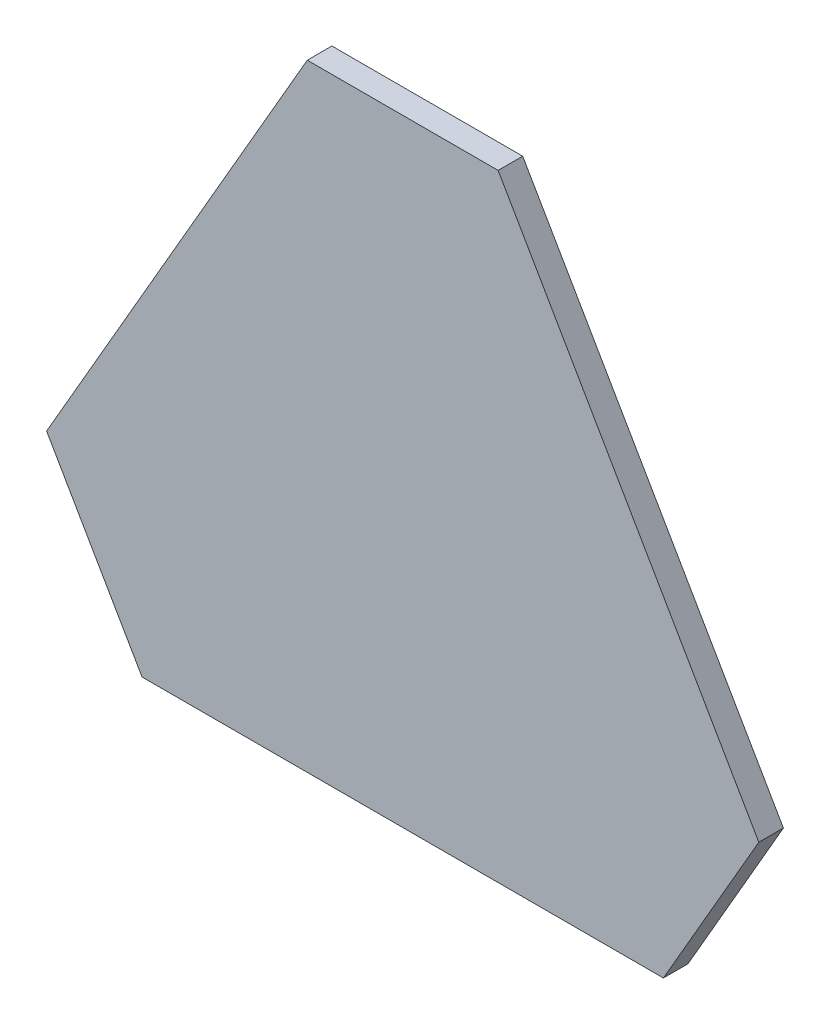
ISO-10303-21;
HEADER;
FILE_DESCRIPTION(('STEP AP214'),'2;1');
FILE_NAME('part.step','',(''),(''),'','','');
FILE_SCHEMA(('AUTOMOTIVE_DESIGN { 1 0 10303 214 1 1 1 1 }'));
ENDSEC;
DATA;
#1=APPLICATION_CONTEXT('core data for automotive mechanical design processes');
#2=APPLICATION_PROTOCOL_DEFINITION('international standard','automotive_design',2000,#1);
#3=PRODUCT_CONTEXT('',#1,'mechanical');
#4=PRODUCT('Part','Part','',(#3));
#5=PRODUCT_RELATED_PRODUCT_CATEGORY('part','',(#4));
#6=PRODUCT_DEFINITION_FORMATION('','',#4);
#7=PRODUCT_DEFINITION_CONTEXT('part definition',#1,'design');
#8=PRODUCT_DEFINITION('design','',#6,#7);
#9=PRODUCT_DEFINITION_SHAPE('','',#8);
#10=(LENGTH_UNIT() NAMED_UNIT(*) SI_UNIT(.MILLI.,.METRE.));
#11=(NAMED_UNIT(*) PLANE_ANGLE_UNIT() SI_UNIT($,.RADIAN.));
#12=(NAMED_UNIT(*) SI_UNIT($,.STERADIAN.) SOLID_ANGLE_UNIT());
#13=UNCERTAINTY_MEASURE_WITH_UNIT(LENGTH_MEASURE(1.E-05),#10,'distance_accuracy_value','');
#14=(GEOMETRIC_REPRESENTATION_CONTEXT(3) GLOBAL_UNCERTAINTY_ASSIGNED_CONTEXT((#13)) GLOBAL_UNIT_ASSIGNED_CONTEXT((#10,
#11,#12)) REPRESENTATION_CONTEXT('',''));
#15=CARTESIAN_POINT('',(0.,0.,0.));
#16=DIRECTION('',(0.,0.,1.));
#17=DIRECTION('',(1.,0.,0.));
#18=AXIS2_PLACEMENT_3D('',#15,#16,#17);
#19=CARTESIAN_POINT('',(1060.66017177982,-1060.66017177982,-100.));
#20=DIRECTION('',(-0.866025403784437,0.500000000000003,0.));
#21=DIRECTION('',(-0.500000000000003,-0.866025403784437,0.));
#22=AXIS2_PLACEMENT_3D('',#19,#20,#21);
#23=PLANE('',#22);
#24=DIRECTION('',(-0.500000000000003,-0.866025403784437,0.));
#25=VECTOR('',#24,1.);
#26=CARTESIAN_POINT('',(1060.66017177982,-1060.66017177982,0.));
#27=LINE('',#26,#25);
#28=CARTESIAN_POINT('',(1448.8887394336,-388.228567653789,0.));
#29=VERTEX_POINT('',#28);
#30=CARTESIAN_POINT('',(1060.66017177982,-1060.66017177982,0.));
#31=VERTEX_POINT('',#30);
#32=EDGE_CURVE('E128',#29,#31,#27,.T.);
#33=ORIENTED_EDGE('',*,*,#32,.T.);
#34=DIRECTION('',(0.,0.,1.));
#35=VECTOR('',#34,1.);
#36=CARTESIAN_POINT('',(1060.66017177982,-1060.66017177982,-100.));
#37=LINE('',#36,#35);
#38=CARTESIAN_POINT('',(1060.66017177982,-1060.66017177982,-100.));
#39=VERTEX_POINT('',#38);
#40=EDGE_CURVE('E11',#39,#31,#37,.T.);
#41=ORIENTED_EDGE('',*,*,#40,.F.);
#42=DIRECTION('',(-0.500000000000003,-0.866025403784437,0.));
#43=VECTOR('',#42,1.);
#44=CARTESIAN_POINT('',(1060.66017177982,-1060.66017177982,-100.));
#45=LINE('',#44,#43);
#46=CARTESIAN_POINT('',(1448.8887394336,-388.228567653789,-100.));
#47=VERTEX_POINT('',#46);
#48=EDGE_CURVE('E144',#47,#39,#45,.T.);
#49=ORIENTED_EDGE('',*,*,#48,.F.);
#50=DIRECTION('',(0.,0.,1.));
#51=VECTOR('',#50,1.);
#52=CARTESIAN_POINT('',(1448.8887394336,-388.228567653789,-100.));
#53=LINE('',#52,#51);
#54=EDGE_CURVE('E124',#47,#29,#53,.T.);
#55=ORIENTED_EDGE('',*,*,#54,.T.);
#56=EDGE_LOOP('',(#33,#41,#49,#55));
#57=FACE_BOUND('',#56,.T.);
#58=ADVANCED_FACE('F39',(#57),#23,.F.);
#59=CARTESIAN_POINT('',(-1060.66017177982,-1060.66017177982,-100.));
#60=DIRECTION('',(0.,1.,0.));
#61=DIRECTION('',(-1.,0.,0.));
#62=AXIS2_PLACEMENT_3D('',#59,#60,#61);
#63=PLANE('',#62);
#64=DIRECTION('',(-1.,0.,0.));
#65=VECTOR('',#64,1.);
#66=CARTESIAN_POINT('',(-1060.66017177982,-1060.66017177982,0.));
#67=LINE('',#66,#65);
#68=CARTESIAN_POINT('',(-1060.66017177982,-1060.66017177982,0.));
#69=VERTEX_POINT('',#68);
#70=EDGE_CURVE('E132',#31,#69,#67,.T.);
#71=ORIENTED_EDGE('',*,*,#70,.T.);
#72=DIRECTION('',(0.,0.,1.));
#73=VECTOR('',#72,1.);
#74=CARTESIAN_POINT('',(-1060.66017177982,-1060.66017177982,-100.));
#75=LINE('',#74,#73);
#76=CARTESIAN_POINT('',(-1060.66017177982,-1060.66017177982,-100.));
#77=VERTEX_POINT('',#76);
#78=EDGE_CURVE('E48',#77,#69,#75,.T.);
#79=ORIENTED_EDGE('',*,*,#78,.F.);
#80=DIRECTION('',(-1.,0.,0.));
#81=VECTOR('',#80,1.);
#82=CARTESIAN_POINT('',(-1060.66017177982,-1060.66017177982,-100.));
#83=LINE('',#82,#81);
#84=EDGE_CURVE('E93',#39,#77,#83,.T.);
#85=ORIENTED_EDGE('',*,*,#84,.F.);
#86=ORIENTED_EDGE('',*,*,#40,.T.);
#87=EDGE_LOOP('',(#71,#79,#85,#86));
#88=FACE_BOUND('',#87,.T.);
#89=ADVANCED_FACE('F172',(#88),#63,.F.);
#90=CARTESIAN_POINT('',(-1448.8887394336,-388.228567653779,-100.));
#91=DIRECTION('',(0.866025403784438,0.500000000000001,0.));
#92=DIRECTION('',(-0.500000000000001,0.866025403784438,0.));
#93=AXIS2_PLACEMENT_3D('',#90,#91,#92);
#94=PLANE('',#93);
#95=DIRECTION('',(-0.500000000000001,0.866025403784438,0.));
#96=VECTOR('',#95,1.);
#97=CARTESIAN_POINT('',(-1448.8887394336,-388.228567653779,0.));
#98=LINE('',#97,#96);
#99=CARTESIAN_POINT('',(-1448.8887394336,-388.228567653779,0.));
#100=VERTEX_POINT('',#99);
#101=EDGE_CURVE('E135',#69,#100,#98,.T.);
#102=ORIENTED_EDGE('',*,*,#101,.T.);
#103=DIRECTION('',(0.,0.,1.));
#104=VECTOR('',#103,1.);
#105=CARTESIAN_POINT('',(-1448.8887394336,-388.228567653779,-100.));
#106=LINE('',#105,#104);
#107=CARTESIAN_POINT('',(-1448.8887394336,-388.228567653779,-100.));
#108=VERTEX_POINT('',#107);
#109=EDGE_CURVE('E117',#108,#100,#106,.T.);
#110=ORIENTED_EDGE('',*,*,#109,.F.);
#111=DIRECTION('',(-0.500000000000001,0.866025403784438,0.));
#112=VECTOR('',#111,1.);
#113=CARTESIAN_POINT('',(-1448.8887394336,-388.228567653779,-100.));
#114=LINE('',#113,#112);
#115=EDGE_CURVE('E106',#77,#108,#114,.T.);
#116=ORIENTED_EDGE('',*,*,#115,.F.);
#117=ORIENTED_EDGE('',*,*,#78,.T.);
#118=EDGE_LOOP('',(#102,#110,#116,#117));
#119=FACE_BOUND('',#118,.T.);
#120=ADVANCED_FACE('F154',(#119),#94,.F.);
#121=CARTESIAN_POINT('',(-388.228567653759,1448.88873943361,-100.));
#122=DIRECTION('',(0.866025403784434,-0.500000000000007,0.));
#123=DIRECTION('',(0.500000000000007,0.866025403784435,0.));
#124=AXIS2_PLACEMENT_3D('',#121,#122,#123);
#125=PLANE('',#124);
#126=DIRECTION('',(0.500000000000007,0.866025403784434,0.));
#127=VECTOR('',#126,1.);
#128=CARTESIAN_POINT('',(-388.228567653759,1448.88873943361,0.));
#129=LINE('',#128,#127);
#130=CARTESIAN_POINT('',(-388.228567653759,1448.88873943361,0.));
#131=VERTEX_POINT('',#130);
#132=EDGE_CURVE('E115',#100,#131,#129,.T.);
#133=ORIENTED_EDGE('',*,*,#132,.T.);
#134=DIRECTION('',(0.,0.,1.));
#135=VECTOR('',#134,1.);
#136=CARTESIAN_POINT('',(-388.228567653759,1448.88873943361,-100.));
#137=LINE('',#136,#135);
#138=CARTESIAN_POINT('',(-388.228567653759,1448.88873943361,-100.));
#139=VERTEX_POINT('',#138);
#140=EDGE_CURVE('E112',#139,#131,#137,.T.);
#141=ORIENTED_EDGE('',*,*,#140,.F.);
#142=DIRECTION('',(0.500000000000007,0.866025403784434,0.));
#143=VECTOR('',#142,1.);
#144=CARTESIAN_POINT('',(-388.228567653759,1448.88873943361,-100.));
#145=LINE('',#144,#143);
#146=EDGE_CURVE('E100',#108,#139,#145,.T.);
#147=ORIENTED_EDGE('',*,*,#146,.F.);
#148=ORIENTED_EDGE('',*,*,#109,.T.);
#149=EDGE_LOOP('',(#133,#141,#147,#148));
#150=FACE_BOUND('',#149,.T.);
#151=ADVANCED_FACE('F113',(#150),#125,.F.);
#152=CARTESIAN_POINT('',(388.228567653794,1448.8887394336,-100.));
#153=DIRECTION('',(0.,-1.,0.));
#154=DIRECTION('',(1.,0.,0.));
#155=AXIS2_PLACEMENT_3D('',#152,#153,#154);
#156=PLANE('',#155);
#157=DIRECTION('',(1.,0.,0.));
#158=VECTOR('',#157,1.);
#159=CARTESIAN_POINT('',(388.228567653794,1448.8887394336,0.));
#160=LINE('',#159,#158);
#161=CARTESIAN_POINT('',(388.228567653794,1448.8887394336,0.));
#162=VERTEX_POINT('',#161);
#163=EDGE_CURVE('E79',#131,#162,#160,.T.);
#164=ORIENTED_EDGE('',*,*,#163,.T.);
#165=DIRECTION('',(0.,0.,1.));
#166=VECTOR('',#165,1.);
#167=CARTESIAN_POINT('',(388.228567653794,1448.8887394336,-100.));
#168=LINE('',#167,#166);
#169=CARTESIAN_POINT('',(388.228567653794,1448.8887394336,-100.));
#170=VERTEX_POINT('',#169);
#171=EDGE_CURVE('E118',#170,#162,#168,.T.);
#172=ORIENTED_EDGE('',*,*,#171,.F.);
#173=DIRECTION('',(1.,0.,0.));
#174=VECTOR('',#173,1.);
#175=CARTESIAN_POINT('',(388.228567653794,1448.8887394336,-100.));
#176=LINE('',#175,#174);
#177=EDGE_CURVE('E104',#139,#170,#176,.T.);
#178=ORIENTED_EDGE('',*,*,#177,.F.);
#179=ORIENTED_EDGE('',*,*,#140,.T.);
#180=EDGE_LOOP('',(#164,#172,#178,#179));
#181=FACE_BOUND('',#180,.T.);
#182=ADVANCED_FACE('F120',(#181),#156,.F.);
#183=CARTESIAN_POINT('',(1448.8887394336,-388.228567653789,-100.));
#184=DIRECTION('',(-0.866025403784442,-0.499999999999994,0.));
#185=DIRECTION('',(0.499999999999994,-0.866025403784442,0.));
#186=AXIS2_PLACEMENT_3D('',#183,#184,#185);
#187=PLANE('',#186);
#188=DIRECTION('',(0.499999999999994,-0.866025403784442,0.));
#189=VECTOR('',#188,1.);
#190=CARTESIAN_POINT('',(1448.8887394336,-388.228567653789,0.));
#191=LINE('',#190,#189);
#192=EDGE_CURVE('E85',#162,#29,#191,.T.);
#193=ORIENTED_EDGE('',*,*,#192,.T.);
#194=ORIENTED_EDGE('',*,*,#54,.F.);
#195=DIRECTION('',(0.499999999999994,-0.866025403784442,0.));
#196=VECTOR('',#195,1.);
#197=CARTESIAN_POINT('',(1448.8887394336,-388.228567653789,-100.));
#198=LINE('',#197,#196);
#199=EDGE_CURVE('E56',#170,#47,#198,.T.);
#200=ORIENTED_EDGE('',*,*,#199,.F.);
#201=ORIENTED_EDGE('',*,*,#171,.T.);
#202=EDGE_LOOP('',(#193,#194,#200,#201));
#203=FACE_BOUND('',#202,.T.);
#204=ADVANCED_FACE('F161',(#203),#187,.F.);
#205=CARTESIAN_POINT('',(0.,0.,-100.));
#206=DIRECTION('',(0.,0.,1.));
#207=DIRECTION('',(1.,0.,0.));
#208=AXIS2_PLACEMENT_3D('',#205,#206,#207);
#209=PLANE('',#208);
#210=ORIENTED_EDGE('',*,*,#48,.T.);
#211=ORIENTED_EDGE('',*,*,#84,.T.);
#212=ORIENTED_EDGE('',*,*,#115,.T.);
#213=ORIENTED_EDGE('',*,*,#146,.T.);
#214=ORIENTED_EDGE('',*,*,#177,.T.);
#215=ORIENTED_EDGE('',*,*,#199,.T.);
#216=EDGE_LOOP('',(#210,#211,#212,#213,#214,#215));
#217=FACE_BOUND('',#216,.T.);
#218=ADVANCED_FACE('F102',(#217),#209,.F.);
#219=CARTESIAN_POINT('',(0.,0.,0.));
#220=DIRECTION('',(0.,0.,1.));
#221=DIRECTION('',(1.,0.,0.));
#222=AXIS2_PLACEMENT_3D('',#219,#220,#221);
#223=PLANE('',#222);
#224=ORIENTED_EDGE('',*,*,#32,.F.);
#225=ORIENTED_EDGE('',*,*,#192,.F.);
#226=ORIENTED_EDGE('',*,*,#163,.F.);
#227=ORIENTED_EDGE('',*,*,#132,.F.);
#228=ORIENTED_EDGE('',*,*,#101,.F.);
#229=ORIENTED_EDGE('',*,*,#70,.F.);
#230=EDGE_LOOP('',(#224,#225,#226,#227,#228,#229));
#231=FACE_BOUND('',#230,.T.);
#232=ADVANCED_FACE('F157',(#231),#223,.T.);
#233=CLOSED_SHELL('',(#58,#89,#120,#151,#182,#204,#218,#232));
#234=MANIFOLD_SOLID_BREP('B2',#233);
#235=ADVANCED_BREP_SHAPE_REPRESENTATION('',(#18,#234),#14);
#236=SHAPE_DEFINITION_REPRESENTATION(#9,#235);
ENDSEC;
END-ISO-10303-21;
